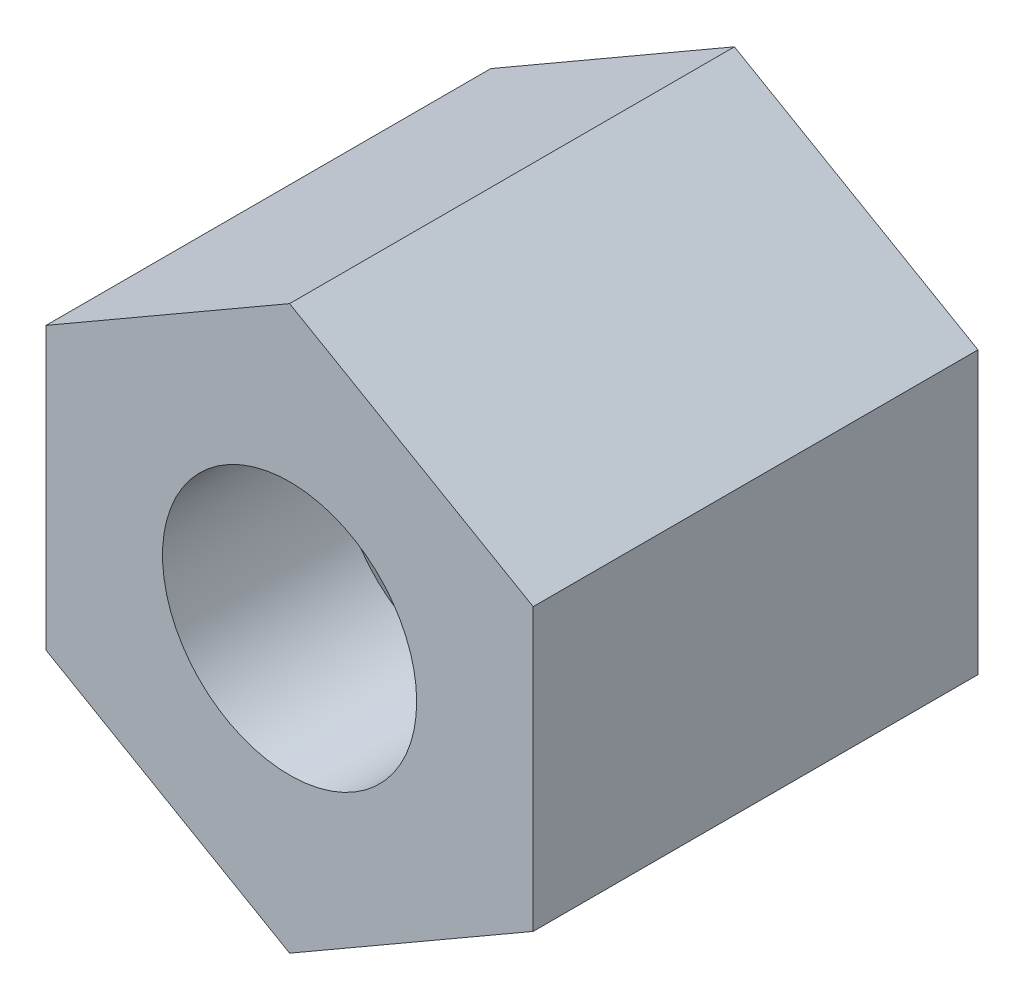
ISO-10303-21;
HEADER;
FILE_DESCRIPTION(('STEP AP214'),'2;1');
FILE_NAME('part.step','',(''),(''),'','','');
FILE_SCHEMA(('AUTOMOTIVE_DESIGN { 1 0 10303 214 1 1 1 1 }'));
ENDSEC;
DATA;
#1=APPLICATION_CONTEXT('core data for automotive mechanical design processes');
#2=APPLICATION_PROTOCOL_DEFINITION('international standard','automotive_design',2000,#1);
#3=PRODUCT_CONTEXT('',#1,'mechanical');
#4=PRODUCT('Part','Part','',(#3));
#5=PRODUCT_RELATED_PRODUCT_CATEGORY('part','',(#4));
#6=PRODUCT_DEFINITION_FORMATION('','',#4);
#7=PRODUCT_DEFINITION_CONTEXT('part definition',#1,'design');
#8=PRODUCT_DEFINITION('design','',#6,#7);
#9=PRODUCT_DEFINITION_SHAPE('','',#8);
#10=(LENGTH_UNIT() NAMED_UNIT(*) SI_UNIT(.MILLI.,.METRE.));
#11=(NAMED_UNIT(*) PLANE_ANGLE_UNIT() SI_UNIT($,.RADIAN.));
#12=(NAMED_UNIT(*) SI_UNIT($,.STERADIAN.) SOLID_ANGLE_UNIT());
#13=UNCERTAINTY_MEASURE_WITH_UNIT(LENGTH_MEASURE(1.E-05),#10,'distance_accuracy_value','');
#14=(GEOMETRIC_REPRESENTATION_CONTEXT(3) GLOBAL_UNCERTAINTY_ASSIGNED_CONTEXT((#13)) GLOBAL_UNIT_ASSIGNED_CONTEXT((#10,
#11,#12)) REPRESENTATION_CONTEXT('',''));
#15=CARTESIAN_POINT('',(0.,0.,0.));
#16=DIRECTION('',(0.,0.,1.));
#17=DIRECTION('',(1.,0.,0.));
#18=AXIS2_PLACEMENT_3D('',#15,#16,#17);
#19=CARTESIAN_POINT('',(23.,13.2790561913614,42.));
#20=DIRECTION('',(-0.5,-0.866025403784439,0.));
#21=DIRECTION('',(0.866025403784439,-0.5,0.));
#22=AXIS2_PLACEMENT_3D('',#19,#20,#21);
#23=PLANE('',#22);
#24=DIRECTION('',(-0.866025403784438,0.5,0.));
#25=VECTOR('',#24,1.);
#26=CARTESIAN_POINT('',(23.,13.2790561913614,0.));
#27=LINE('',#26,#25);
#28=CARTESIAN_POINT('',(23.,13.2790561913614,0.));
#29=VERTEX_POINT('',#28);
#30=CARTESIAN_POINT('',(0.,26.5581123827228,0.));
#31=VERTEX_POINT('',#30);
#32=EDGE_CURVE('E117',#29,#31,#27,.T.);
#33=ORIENTED_EDGE('',*,*,#32,.T.);
#34=DIRECTION('',(0.,0.,-1.));
#35=VECTOR('',#34,1.);
#36=CARTESIAN_POINT('',(0.,26.5581123827228,42.));
#37=LINE('',#36,#35);
#38=CARTESIAN_POINT('',(0.,26.5581123827228,42.));
#39=VERTEX_POINT('',#38);
#40=EDGE_CURVE('E11',#39,#31,#37,.T.);
#41=ORIENTED_EDGE('',*,*,#40,.F.);
#42=DIRECTION('',(-0.866025403784438,0.5,0.));
#43=VECTOR('',#42,1.);
#44=CARTESIAN_POINT('',(23.,13.2790561913614,42.));
#45=LINE('',#44,#43);
#46=CARTESIAN_POINT('',(23.,13.2790561913614,42.));
#47=VERTEX_POINT('',#46);
#48=EDGE_CURVE('E128',#47,#39,#45,.T.);
#49=ORIENTED_EDGE('',*,*,#48,.F.);
#50=DIRECTION('',(0.,0.,-1.));
#51=VECTOR('',#50,1.);
#52=CARTESIAN_POINT('',(23.,13.2790561913614,42.));
#53=LINE('',#52,#51);
#54=EDGE_CURVE('E113',#47,#29,#53,.T.);
#55=ORIENTED_EDGE('',*,*,#54,.T.);
#56=EDGE_LOOP('',(#33,#41,#49,#55));
#57=FACE_BOUND('',#56,.T.);
#58=ADVANCED_FACE('F32',(#57),#23,.F.);
#59=CARTESIAN_POINT('',(0.,26.5581123827228,42.));
#60=DIRECTION('',(0.5,-0.866025403784439,0.));
#61=DIRECTION('',(0.866025403784439,0.5,0.));
#62=AXIS2_PLACEMENT_3D('',#59,#60,#61);
#63=PLANE('',#62);
#64=DIRECTION('',(-0.866025403784439,-0.5,0.));
#65=VECTOR('',#64,1.);
#66=CARTESIAN_POINT('',(0.,26.5581123827228,0.));
#67=LINE('',#66,#65);
#68=CARTESIAN_POINT('',(-23.,13.2790561913614,0.));
#69=VERTEX_POINT('',#68);
#70=EDGE_CURVE('E120',#31,#69,#67,.T.);
#71=ORIENTED_EDGE('',*,*,#70,.T.);
#72=DIRECTION('',(0.,0.,-1.));
#73=VECTOR('',#72,1.);
#74=CARTESIAN_POINT('',(-23.,13.2790561913614,42.));
#75=LINE('',#74,#73);
#76=CARTESIAN_POINT('',(-23.,13.2790561913614,42.));
#77=VERTEX_POINT('',#76);
#78=EDGE_CURVE('E41',#77,#69,#75,.T.);
#79=ORIENTED_EDGE('',*,*,#78,.F.);
#80=DIRECTION('',(-0.866025403784439,-0.5,0.));
#81=VECTOR('',#80,1.);
#82=CARTESIAN_POINT('',(0.,26.5581123827228,42.));
#83=LINE('',#82,#81);
#84=EDGE_CURVE('E86',#39,#77,#83,.T.);
#85=ORIENTED_EDGE('',*,*,#84,.F.);
#86=ORIENTED_EDGE('',*,*,#40,.T.);
#87=EDGE_LOOP('',(#71,#79,#85,#86));
#88=FACE_BOUND('',#87,.T.);
#89=ADVANCED_FACE('F154',(#88),#63,.F.);
#90=CARTESIAN_POINT('',(-23.,13.2790561913614,42.));
#91=DIRECTION('',(1.,0.,0.));
#92=DIRECTION('',(0.,0.,-1.));
#93=AXIS2_PLACEMENT_3D('',#90,#91,#92);
#94=PLANE('',#93);
#95=DIRECTION('',(0.,-1.,0.));
#96=VECTOR('',#95,1.);
#97=CARTESIAN_POINT('',(-23.,13.2790561913614,0.));
#98=LINE('',#97,#96);
#99=CARTESIAN_POINT('',(-23.,-13.2790561913614,0.));
#100=VERTEX_POINT('',#99);
#101=EDGE_CURVE('E123',#69,#100,#98,.T.);
#102=ORIENTED_EDGE('',*,*,#101,.T.);
#103=DIRECTION('',(0.,0.,-1.));
#104=VECTOR('',#103,1.);
#105=CARTESIAN_POINT('',(-23.,-13.2790561913614,42.));
#106=LINE('',#105,#104);
#107=CARTESIAN_POINT('',(-23.,-13.2790561913614,42.));
#108=VERTEX_POINT('',#107);
#109=EDGE_CURVE('E108',#108,#100,#106,.T.);
#110=ORIENTED_EDGE('',*,*,#109,.F.);
#111=DIRECTION('',(0.,-1.,0.));
#112=VECTOR('',#111,1.);
#113=CARTESIAN_POINT('',(-23.,13.2790561913614,42.));
#114=LINE('',#113,#112);
#115=EDGE_CURVE('E99',#77,#108,#114,.T.);
#116=ORIENTED_EDGE('',*,*,#115,.F.);
#117=ORIENTED_EDGE('',*,*,#78,.T.);
#118=EDGE_LOOP('',(#102,#110,#116,#117));
#119=FACE_BOUND('',#118,.T.);
#120=ADVANCED_FACE('F135',(#119),#94,.F.);
#121=CARTESIAN_POINT('',(-23.,-13.2790561913614,42.));
#122=DIRECTION('',(0.5,0.866025403784439,0.));
#123=DIRECTION('',(-0.866025403784439,0.5,0.));
#124=AXIS2_PLACEMENT_3D('',#121,#122,#123);
#125=PLANE('',#124);
#126=DIRECTION('',(0.866025403784438,-0.5,0.));
#127=VECTOR('',#126,1.);
#128=CARTESIAN_POINT('',(-23.,-13.2790561913614,0.));
#129=LINE('',#128,#127);
#130=CARTESIAN_POINT('',(0.,-26.5581123827228,0.));
#131=VERTEX_POINT('',#130);
#132=EDGE_CURVE('E107',#100,#131,#129,.T.);
#133=ORIENTED_EDGE('',*,*,#132,.T.);
#134=DIRECTION('',(0.,0.,-1.));
#135=VECTOR('',#134,1.);
#136=CARTESIAN_POINT('',(0.,-26.5581123827228,42.));
#137=LINE('',#136,#135);
#138=CARTESIAN_POINT('',(0.,-26.5581123827228,42.));
#139=VERTEX_POINT('',#138);
#140=EDGE_CURVE('E104',#139,#131,#137,.T.);
#141=ORIENTED_EDGE('',*,*,#140,.F.);
#142=DIRECTION('',(0.866025403784438,-0.5,0.));
#143=VECTOR('',#142,1.);
#144=CARTESIAN_POINT('',(-23.,-13.2790561913614,42.));
#145=LINE('',#144,#143);
#146=EDGE_CURVE('E93',#108,#139,#145,.T.);
#147=ORIENTED_EDGE('',*,*,#146,.F.);
#148=ORIENTED_EDGE('',*,*,#109,.T.);
#149=EDGE_LOOP('',(#133,#141,#147,#148));
#150=FACE_BOUND('',#149,.T.);
#151=ADVANCED_FACE('F105',(#150),#125,.F.);
#152=CARTESIAN_POINT('',(0.,-26.5581123827228,42.));
#153=DIRECTION('',(-0.5,0.866025403784439,0.));
#154=DIRECTION('',(-0.866025403784439,-0.5,0.));
#155=AXIS2_PLACEMENT_3D('',#152,#153,#154);
#156=PLANE('',#155);
#157=DIRECTION('',(0.866025403784439,0.5,0.));
#158=VECTOR('',#157,1.);
#159=CARTESIAN_POINT('',(0.,-26.5581123827228,0.));
#160=LINE('',#159,#158);
#161=CARTESIAN_POINT('',(23.,-13.2790561913614,0.));
#162=VERTEX_POINT('',#161);
#163=EDGE_CURVE('E72',#131,#162,#160,.T.);
#164=ORIENTED_EDGE('',*,*,#163,.T.);
#165=DIRECTION('',(0.,0.,-1.));
#166=VECTOR('',#165,1.);
#167=CARTESIAN_POINT('',(23.,-13.2790561913614,42.));
#168=LINE('',#167,#166);
#169=CARTESIAN_POINT('',(23.,-13.2790561913614,42.));
#170=VERTEX_POINT('',#169);
#171=EDGE_CURVE('E109',#170,#162,#168,.T.);
#172=ORIENTED_EDGE('',*,*,#171,.F.);
#173=DIRECTION('',(0.866025403784439,0.5,0.));
#174=VECTOR('',#173,1.);
#175=CARTESIAN_POINT('',(0.,-26.5581123827228,42.));
#176=LINE('',#175,#174);
#177=EDGE_CURVE('E97',#139,#170,#176,.T.);
#178=ORIENTED_EDGE('',*,*,#177,.F.);
#179=ORIENTED_EDGE('',*,*,#140,.T.);
#180=EDGE_LOOP('',(#164,#172,#178,#179));
#181=FACE_BOUND('',#180,.T.);
#182=ADVANCED_FACE('F111',(#181),#156,.F.);
#183=CARTESIAN_POINT('',(23.,-13.2790561913614,42.));
#184=DIRECTION('',(-1.,0.,0.));
#185=DIRECTION('',(0.,0.,1.));
#186=AXIS2_PLACEMENT_3D('',#183,#184,#185);
#187=PLANE('',#186);
#188=DIRECTION('',(0.,1.,0.));
#189=VECTOR('',#188,1.);
#190=CARTESIAN_POINT('',(23.,-13.2790561913614,0.));
#191=LINE('',#190,#189);
#192=EDGE_CURVE('E78',#162,#29,#191,.T.);
#193=ORIENTED_EDGE('',*,*,#192,.T.);
#194=ORIENTED_EDGE('',*,*,#54,.F.);
#195=DIRECTION('',(0.,1.,0.));
#196=VECTOR('',#195,1.);
#197=CARTESIAN_POINT('',(23.,-13.2790561913614,42.));
#198=LINE('',#197,#196);
#199=EDGE_CURVE('E49',#170,#47,#198,.T.);
#200=ORIENTED_EDGE('',*,*,#199,.F.);
#201=ORIENTED_EDGE('',*,*,#171,.T.);
#202=EDGE_LOOP('',(#193,#194,#200,#201));
#203=FACE_BOUND('',#202,.T.);
#204=ADVANCED_FACE('F142',(#203),#187,.F.);
#205=CARTESIAN_POINT('',(0.,26.5581123827228,42.));
#206=DIRECTION('',(0.,0.,1.));
#207=DIRECTION('',(1.,0.,0.));
#208=AXIS2_PLACEMENT_3D('',#205,#206,#207);
#209=PLANE('',#208);
#210=CARTESIAN_POINT('',(0.,0.,42.));
#211=DIRECTION('',(0.,0.,1.));
#212=DIRECTION('',(1.,0.,0.));
#213=AXIS2_PLACEMENT_3D('',#210,#211,#212);
#214=CIRCLE('',#213,12.);
#215=CARTESIAN_POINT('',(12.,0.,42.));
#216=VERTEX_POINT('',#215);
#217=EDGE_CURVE('E237',#216,#216,#214,.T.);
#218=ORIENTED_EDGE('',*,*,#217,.F.);
#219=EDGE_LOOP('',(#218));
#220=FACE_BOUND('',#219,.T.);
#221=ORIENTED_EDGE('',*,*,#48,.T.);
#222=ORIENTED_EDGE('',*,*,#84,.T.);
#223=ORIENTED_EDGE('',*,*,#115,.T.);
#224=ORIENTED_EDGE('',*,*,#146,.T.);
#225=ORIENTED_EDGE('',*,*,#177,.T.);
#226=ORIENTED_EDGE('',*,*,#199,.T.);
#227=EDGE_LOOP('',(#221,#222,#223,#224,#225,#226));
#228=FACE_BOUND('',#227,.T.);
#229=ADVANCED_FACE('F95',(#220,#228),#209,.T.);
#230=CARTESIAN_POINT('',(0.,26.5581123827228,0.));
#231=DIRECTION('',(0.,0.,1.));
#232=DIRECTION('',(1.,0.,0.));
#233=AXIS2_PLACEMENT_3D('',#230,#231,#232);
#234=PLANE('',#233);
#235=CARTESIAN_POINT('',(0.,0.,0.));
#236=DIRECTION('',(0.,0.,-1.));
#237=DIRECTION('',(-1.,0.,0.));
#238=AXIS2_PLACEMENT_3D('',#235,#236,#237);
#239=CIRCLE('',#238,15.);
#240=CARTESIAN_POINT('',(-15.,0.,0.));
#241=VERTEX_POINT('',#240);
#242=EDGE_CURVE('E121',#241,#241,#239,.T.);
#243=ORIENTED_EDGE('',*,*,#242,.F.);
#244=EDGE_LOOP('',(#243));
#245=FACE_BOUND('',#244,.T.);
#246=ORIENTED_EDGE('',*,*,#32,.F.);
#247=ORIENTED_EDGE('',*,*,#192,.F.);
#248=ORIENTED_EDGE('',*,*,#163,.F.);
#249=ORIENTED_EDGE('',*,*,#132,.F.);
#250=ORIENTED_EDGE('',*,*,#101,.F.);
#251=ORIENTED_EDGE('',*,*,#70,.F.);
#252=EDGE_LOOP('',(#246,#247,#248,#249,#250,#251));
#253=FACE_BOUND('',#252,.T.);
#254=ADVANCED_FACE('F138',(#245,#253),#234,.F.);
#255=CARTESIAN_POINT('',(0.,0.,20.));
#256=DIRECTION('',(0.,0.,-1.));
#257=DIRECTION('',(-1.,0.,0.));
#258=AXIS2_PLACEMENT_3D('',#255,#256,#257);
#259=CYLINDRICAL_SURFACE('',#258,15.);
#260=CARTESIAN_POINT('',(0.,0.,20.));
#261=DIRECTION('',(0.,0.,-1.));
#262=DIRECTION('',(-1.,0.,0.));
#263=AXIS2_PLACEMENT_3D('',#260,#261,#262);
#264=CIRCLE('',#263,15.);
#265=CARTESIAN_POINT('',(-15.,0.,20.));
#266=VERTEX_POINT('',#265);
#267=EDGE_CURVE('E242',#266,#266,#264,.T.);
#268=ORIENTED_EDGE('',*,*,#267,.F.);
#269=EDGE_LOOP('',(#268));
#270=FACE_BOUND('',#269,.T.);
#271=ORIENTED_EDGE('',*,*,#242,.T.);
#272=EDGE_LOOP('',(#271));
#273=FACE_BOUND('',#272,.T.);
#274=ADVANCED_FACE('F186',(#270,#273),#259,.F.);
#275=CARTESIAN_POINT('',(0.,0.,20.));
#276=DIRECTION('',(0.,0.,-1.));
#277=DIRECTION('',(-1.,0.,0.));
#278=AXIS2_PLACEMENT_3D('',#275,#276,#277);
#279=CONICAL_SURFACE('',#278,15.,0.436332312998583);
#280=CARTESIAN_POINT('',(0.,0.,24.));
#281=DIRECTION('',(0.,0.,-1.));
#282=DIRECTION('',(-1.,0.,0.));
#283=AXIS2_PLACEMENT_3D('',#280,#281,#282);
#284=CIRCLE('',#283,13.13476936738);
#285=CARTESIAN_POINT('',(-13.13476936738,0.,24.));
#286=VERTEX_POINT('',#285);
#287=EDGE_CURVE('E240',#286,#286,#284,.T.);
#288=ORIENTED_EDGE('',*,*,#287,.F.);
#289=EDGE_LOOP('',(#288));
#290=FACE_BOUND('',#289,.T.);
#291=ORIENTED_EDGE('',*,*,#267,.T.);
#292=EDGE_LOOP('',(#291));
#293=FACE_BOUND('',#292,.T.);
#294=ADVANCED_FACE('F195',(#290,#293),#279,.F.);
#295=CARTESIAN_POINT('',(0.,0.,24.));
#296=DIRECTION('',(0.,0.,-1.));
#297=DIRECTION('',(-1.,0.,0.));
#298=AXIS2_PLACEMENT_3D('',#295,#296,#297);
#299=CONICAL_SURFACE('',#298,13.13476936738,0.698131700797733);
#300=CARTESIAN_POINT('',(0.,0.,25.352365470341));
#301=DIRECTION('',(0.,0.,-1.));
#302=DIRECTION('',(-1.,0.,0.));
#303=AXIS2_PLACEMENT_3D('',#300,#301,#302);
#304=CIRCLE('',#303,12.);
#305=CARTESIAN_POINT('',(-12.,0.,25.352365470341));
#306=VERTEX_POINT('',#305);
#307=EDGE_CURVE('E35',#306,#306,#304,.F.);
#308=ORIENTED_EDGE('',*,*,#307,.T.);
#309=EDGE_LOOP('',(#308));
#310=FACE_BOUND('',#309,.T.);
#311=ORIENTED_EDGE('',*,*,#287,.T.);
#312=EDGE_LOOP('',(#311));
#313=FACE_BOUND('',#312,.T.);
#314=ADVANCED_FACE('F205',(#310,#313),#299,.F.);
#315=CARTESIAN_POINT('',(0.,0.,24.));
#316=DIRECTION('',(0.,0.,1.));
#317=DIRECTION('',(1.,0.,0.));
#318=AXIS2_PLACEMENT_3D('',#315,#316,#317);
#319=CYLINDRICAL_SURFACE('',#318,12.);
#320=ORIENTED_EDGE('',*,*,#217,.T.);
#321=EDGE_LOOP('',(#320));
#322=FACE_BOUND('',#321,.T.);
#323=ORIENTED_EDGE('',*,*,#307,.F.);
#324=EDGE_LOOP('',(#323));
#325=FACE_BOUND('',#324,.T.);
#326=ADVANCED_FACE('F220',(#322,#325),#319,.F.);
#327=CLOSED_SHELL('',(#58,#89,#120,#151,#182,#204,#229,#254,#274,#294,#314,#326));
#328=MANIFOLD_SOLID_BREP('B2',#327);
#329=ADVANCED_BREP_SHAPE_REPRESENTATION('',(#18,#328),#14);
#330=SHAPE_DEFINITION_REPRESENTATION(#9,#329);
ENDSEC;
END-ISO-10303-21;
